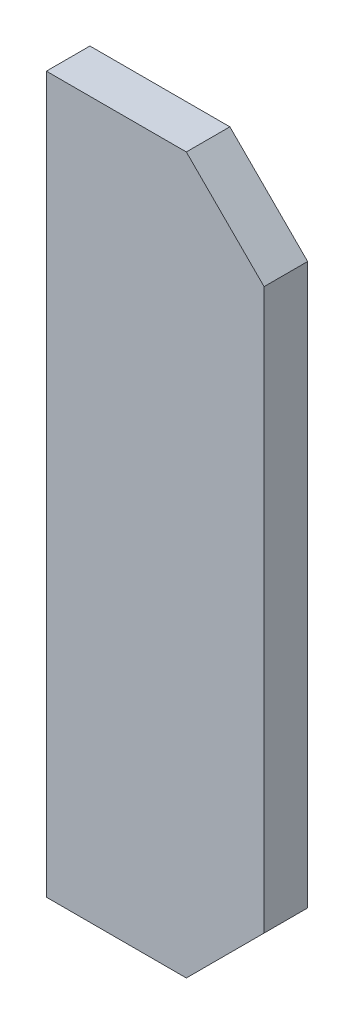
ISO-10303-21;
HEADER;
FILE_DESCRIPTION(('STEP AP214'),'2;1');
FILE_NAME('part.step','',(''),(''),'','','');
FILE_SCHEMA(('AUTOMOTIVE_DESIGN { 1 0 10303 214 1 1 1 1 }'));
ENDSEC;
DATA;
#1=APPLICATION_CONTEXT('core data for automotive mechanical design processes');
#2=APPLICATION_PROTOCOL_DEFINITION('international standard','automotive_design',2000,#1);
#3=PRODUCT_CONTEXT('',#1,'mechanical');
#4=PRODUCT('Part','Part','',(#3));
#5=PRODUCT_RELATED_PRODUCT_CATEGORY('part','',(#4));
#6=PRODUCT_DEFINITION_FORMATION('','',#4);
#7=PRODUCT_DEFINITION_CONTEXT('part definition',#1,'design');
#8=PRODUCT_DEFINITION('design','',#6,#7);
#9=PRODUCT_DEFINITION_SHAPE('','',#8);
#10=(LENGTH_UNIT() NAMED_UNIT(*) SI_UNIT(.MILLI.,.METRE.));
#11=(NAMED_UNIT(*) PLANE_ANGLE_UNIT() SI_UNIT($,.RADIAN.));
#12=(NAMED_UNIT(*) SI_UNIT($,.STERADIAN.) SOLID_ANGLE_UNIT());
#13=UNCERTAINTY_MEASURE_WITH_UNIT(LENGTH_MEASURE(1.E-05),#10,'distance_accuracy_value','');
#14=(GEOMETRIC_REPRESENTATION_CONTEXT(3) GLOBAL_UNCERTAINTY_ASSIGNED_CONTEXT((#13)) GLOBAL_UNIT_ASSIGNED_CONTEXT((#10,
#11,#12)) REPRESENTATION_CONTEXT('',''));
#15=CARTESIAN_POINT('',(0.,0.,0.));
#16=DIRECTION('',(0.,0.,1.));
#17=DIRECTION('',(1.,0.,0.));
#18=AXIS2_PLACEMENT_3D('',#15,#16,#17);
#19=CARTESIAN_POINT('',(0.,0.,14.));
#20=DIRECTION('',(1.,0.,0.));
#21=DIRECTION('',(0.,0.,-1.));
#22=AXIS2_PLACEMENT_3D('',#19,#20,#21);
#23=PLANE('',#22);
#24=DIRECTION('',(0.,-1.,0.));
#25=VECTOR('',#24,1.);
#26=CARTESIAN_POINT('',(0.,0.,0.));
#27=LINE('',#26,#25);
#28=CARTESIAN_POINT('',(0.,230.,0.));
#29=VERTEX_POINT('',#28);
#30=CARTESIAN_POINT('',(0.,0.,0.));
#31=VERTEX_POINT('',#30);
#32=EDGE_CURVE('E116',#29,#31,#27,.T.);
#33=ORIENTED_EDGE('',*,*,#32,.T.);
#34=DIRECTION('',(0.,0.,-1.));
#35=VECTOR('',#34,1.);
#36=CARTESIAN_POINT('',(0.,0.,14.));
#37=LINE('',#36,#35);
#38=CARTESIAN_POINT('',(0.,0.,14.));
#39=VERTEX_POINT('',#38);
#40=EDGE_CURVE('E11',#39,#31,#37,.T.);
#41=ORIENTED_EDGE('',*,*,#40,.F.);
#42=DIRECTION('',(0.,-1.,0.));
#43=VECTOR('',#42,1.);
#44=CARTESIAN_POINT('',(0.,0.,14.));
#45=LINE('',#44,#43);
#46=CARTESIAN_POINT('',(0.,230.,14.));
#47=VERTEX_POINT('',#46);
#48=EDGE_CURVE('E126',#47,#39,#45,.T.);
#49=ORIENTED_EDGE('',*,*,#48,.F.);
#50=DIRECTION('',(0.,0.,-1.));
#51=VECTOR('',#50,1.);
#52=CARTESIAN_POINT('',(0.,230.,14.));
#53=LINE('',#52,#51);
#54=EDGE_CURVE('E112',#47,#29,#53,.T.);
#55=ORIENTED_EDGE('',*,*,#54,.T.);
#56=EDGE_LOOP('',(#33,#41,#49,#55));
#57=FACE_BOUND('',#56,.T.);
#58=ADVANCED_FACE('F32',(#57),#23,.F.);
#59=CARTESIAN_POINT('',(0.,0.,14.));
#60=DIRECTION('',(0.,1.,0.));
#61=DIRECTION('',(0.,0.,1.));
#62=AXIS2_PLACEMENT_3D('',#59,#60,#61);
#63=PLANE('',#62);
#64=DIRECTION('',(1.,0.,0.));
#65=VECTOR('',#64,1.);
#66=CARTESIAN_POINT('',(0.,0.,0.));
#67=LINE('',#66,#65);
#68=CARTESIAN_POINT('',(45.,0.,0.));
#69=VERTEX_POINT('',#68);
#70=EDGE_CURVE('E119',#31,#69,#67,.T.);
#71=ORIENTED_EDGE('',*,*,#70,.T.);
#72=DIRECTION('',(0.,0.,-1.));
#73=VECTOR('',#72,1.);
#74=CARTESIAN_POINT('',(45.,0.,14.));
#75=LINE('',#74,#73);
#76=CARTESIAN_POINT('',(45.,0.,14.));
#77=VERTEX_POINT('',#76);
#78=EDGE_CURVE('E40',#77,#69,#75,.T.);
#79=ORIENTED_EDGE('',*,*,#78,.F.);
#80=DIRECTION('',(1.,0.,0.));
#81=VECTOR('',#80,1.);
#82=CARTESIAN_POINT('',(0.,0.,14.));
#83=LINE('',#82,#81);
#84=EDGE_CURVE('E85',#39,#77,#83,.T.);
#85=ORIENTED_EDGE('',*,*,#84,.F.);
#86=ORIENTED_EDGE('',*,*,#40,.T.);
#87=EDGE_LOOP('',(#71,#79,#85,#86));
#88=FACE_BOUND('',#87,.T.);
#89=ADVANCED_FACE('F150',(#88),#63,.F.);
#90=CARTESIAN_POINT('',(45.,0.,14.));
#91=DIRECTION('',(-0.707106781186552,0.707106781186543,0.));
#92=DIRECTION('',(-0.707106781186543,-0.707106781186552,0.));
#93=AXIS2_PLACEMENT_3D('',#90,#91,#92);
#94=PLANE('',#93);
#95=DIRECTION('',(0.707106781186543,0.707106781186552,0.));
#96=VECTOR('',#95,1.);
#97=CARTESIAN_POINT('',(45.,0.,0.));
#98=LINE('',#97,#96);
#99=CARTESIAN_POINT('',(70.,25.0000000000003,0.));
#100=VERTEX_POINT('',#99);
#101=EDGE_CURVE('E121',#69,#100,#98,.T.);
#102=ORIENTED_EDGE('',*,*,#101,.T.);
#103=DIRECTION('',(0.,0.,-1.));
#104=VECTOR('',#103,1.);
#105=CARTESIAN_POINT('',(70.,25.0000000000003,14.));
#106=LINE('',#105,#104);
#107=CARTESIAN_POINT('',(70.,25.0000000000003,14.));
#108=VERTEX_POINT('',#107);
#109=EDGE_CURVE('E107',#108,#100,#106,.T.);
#110=ORIENTED_EDGE('',*,*,#109,.F.);
#111=DIRECTION('',(0.707106781186543,0.707106781186552,0.));
#112=VECTOR('',#111,1.);
#113=CARTESIAN_POINT('',(45.,0.,14.));
#114=LINE('',#113,#112);
#115=EDGE_CURVE('E98',#77,#108,#114,.T.);
#116=ORIENTED_EDGE('',*,*,#115,.F.);
#117=ORIENTED_EDGE('',*,*,#78,.T.);
#118=EDGE_LOOP('',(#102,#110,#116,#117));
#119=FACE_BOUND('',#118,.T.);
#120=ADVANCED_FACE('F132',(#119),#94,.F.);
#121=CARTESIAN_POINT('',(70.,25.0000000000003,14.));
#122=DIRECTION('',(-1.,0.,0.));
#123=DIRECTION('',(0.,-1.,0.));
#124=AXIS2_PLACEMENT_3D('',#121,#122,#123);
#125=PLANE('',#124);
#126=DIRECTION('',(0.,1.,0.));
#127=VECTOR('',#126,1.);
#128=CARTESIAN_POINT('',(70.,25.0000000000003,0.));
#129=LINE('',#128,#127);
#130=CARTESIAN_POINT('',(70.,205.,0.));
#131=VERTEX_POINT('',#130);
#132=EDGE_CURVE('E106',#100,#131,#129,.T.);
#133=ORIENTED_EDGE('',*,*,#132,.T.);
#134=DIRECTION('',(0.,0.,-1.));
#135=VECTOR('',#134,1.);
#136=CARTESIAN_POINT('',(70.,205.,14.));
#137=LINE('',#136,#135);
#138=CARTESIAN_POINT('',(70.,205.,14.));
#139=VERTEX_POINT('',#138);
#140=EDGE_CURVE('E103',#139,#131,#137,.T.);
#141=ORIENTED_EDGE('',*,*,#140,.F.);
#142=DIRECTION('',(0.,1.,0.));
#143=VECTOR('',#142,1.);
#144=CARTESIAN_POINT('',(70.,25.0000000000003,14.));
#145=LINE('',#144,#143);
#146=EDGE_CURVE('E92',#108,#139,#145,.T.);
#147=ORIENTED_EDGE('',*,*,#146,.F.);
#148=ORIENTED_EDGE('',*,*,#109,.T.);
#149=EDGE_LOOP('',(#133,#141,#147,#148));
#150=FACE_BOUND('',#149,.T.);
#151=ADVANCED_FACE('F104',(#150),#125,.F.);
#152=CARTESIAN_POINT('',(45.,230.,14.));
#153=DIRECTION('',(-0.707106781186552,-0.707106781186543,0.));
#154=DIRECTION('',(0.707106781186543,-0.707106781186552,0.));
#155=AXIS2_PLACEMENT_3D('',#152,#153,#154);
#156=PLANE('',#155);
#157=DIRECTION('',(-0.707106781186543,0.707106781186552,0.));
#158=VECTOR('',#157,1.);
#159=CARTESIAN_POINT('',(45.,230.,0.));
#160=LINE('',#159,#158);
#161=CARTESIAN_POINT('',(45.,230.,0.));
#162=VERTEX_POINT('',#161);
#163=EDGE_CURVE('E71',#131,#162,#160,.T.);
#164=ORIENTED_EDGE('',*,*,#163,.T.);
#165=DIRECTION('',(0.,0.,-1.));
#166=VECTOR('',#165,1.);
#167=CARTESIAN_POINT('',(45.,230.,14.));
#168=LINE('',#167,#166);
#169=CARTESIAN_POINT('',(45.,230.,14.));
#170=VERTEX_POINT('',#169);
#171=EDGE_CURVE('E108',#170,#162,#168,.T.);
#172=ORIENTED_EDGE('',*,*,#171,.F.);
#173=DIRECTION('',(-0.707106781186543,0.707106781186552,0.));
#174=VECTOR('',#173,1.);
#175=CARTESIAN_POINT('',(45.,230.,14.));
#176=LINE('',#175,#174);
#177=EDGE_CURVE('E96',#139,#170,#176,.T.);
#178=ORIENTED_EDGE('',*,*,#177,.F.);
#179=ORIENTED_EDGE('',*,*,#140,.T.);
#180=EDGE_LOOP('',(#164,#172,#178,#179));
#181=FACE_BOUND('',#180,.T.);
#182=ADVANCED_FACE('F110',(#181),#156,.F.);
#183=CARTESIAN_POINT('',(0.,230.,14.));
#184=DIRECTION('',(0.,-1.,0.));
#185=DIRECTION('',(0.,0.,-1.));
#186=AXIS2_PLACEMENT_3D('',#183,#184,#185);
#187=PLANE('',#186);
#188=DIRECTION('',(-1.,0.,0.));
#189=VECTOR('',#188,1.);
#190=CARTESIAN_POINT('',(0.,230.,0.));
#191=LINE('',#190,#189);
#192=EDGE_CURVE('E77',#162,#29,#191,.T.);
#193=ORIENTED_EDGE('',*,*,#192,.T.);
#194=ORIENTED_EDGE('',*,*,#54,.F.);
#195=DIRECTION('',(-1.,0.,0.));
#196=VECTOR('',#195,1.);
#197=CARTESIAN_POINT('',(0.,230.,14.));
#198=LINE('',#197,#196);
#199=EDGE_CURVE('E48',#170,#47,#198,.T.);
#200=ORIENTED_EDGE('',*,*,#199,.F.);
#201=ORIENTED_EDGE('',*,*,#171,.T.);
#202=EDGE_LOOP('',(#193,#194,#200,#201));
#203=FACE_BOUND('',#202,.T.);
#204=ADVANCED_FACE('F139',(#203),#187,.F.);
#205=CARTESIAN_POINT('',(0.,230.,14.));
#206=DIRECTION('',(0.,0.,-1.));
#207=DIRECTION('',(-1.,0.,0.));
#208=AXIS2_PLACEMENT_3D('',#205,#206,#207);
#209=PLANE('',#208);
#210=ORIENTED_EDGE('',*,*,#48,.T.);
#211=ORIENTED_EDGE('',*,*,#84,.T.);
#212=ORIENTED_EDGE('',*,*,#115,.T.);
#213=ORIENTED_EDGE('',*,*,#146,.T.);
#214=ORIENTED_EDGE('',*,*,#177,.T.);
#215=ORIENTED_EDGE('',*,*,#199,.T.);
#216=EDGE_LOOP('',(#210,#211,#212,#213,#214,#215));
#217=FACE_BOUND('',#216,.T.);
#218=ADVANCED_FACE('F94',(#217),#209,.F.);
#219=CARTESIAN_POINT('',(0.,230.,0.));
#220=DIRECTION('',(0.,0.,-1.));
#221=DIRECTION('',(-1.,0.,0.));
#222=AXIS2_PLACEMENT_3D('',#219,#220,#221);
#223=PLANE('',#222);
#224=ORIENTED_EDGE('',*,*,#32,.F.);
#225=ORIENTED_EDGE('',*,*,#192,.F.);
#226=ORIENTED_EDGE('',*,*,#163,.F.);
#227=ORIENTED_EDGE('',*,*,#132,.F.);
#228=ORIENTED_EDGE('',*,*,#101,.F.);
#229=ORIENTED_EDGE('',*,*,#70,.F.);
#230=EDGE_LOOP('',(#224,#225,#226,#227,#228,#229));
#231=FACE_BOUND('',#230,.T.);
#232=ADVANCED_FACE('F135',(#231),#223,.T.);
#233=CLOSED_SHELL('',(#58,#89,#120,#151,#182,#204,#218,#232));
#234=MANIFOLD_SOLID_BREP('B2',#233);
#235=ADVANCED_BREP_SHAPE_REPRESENTATION('',(#18,#234),#14);
#236=SHAPE_DEFINITION_REPRESENTATION(#9,#235);
ENDSEC;
END-ISO-10303-21;
